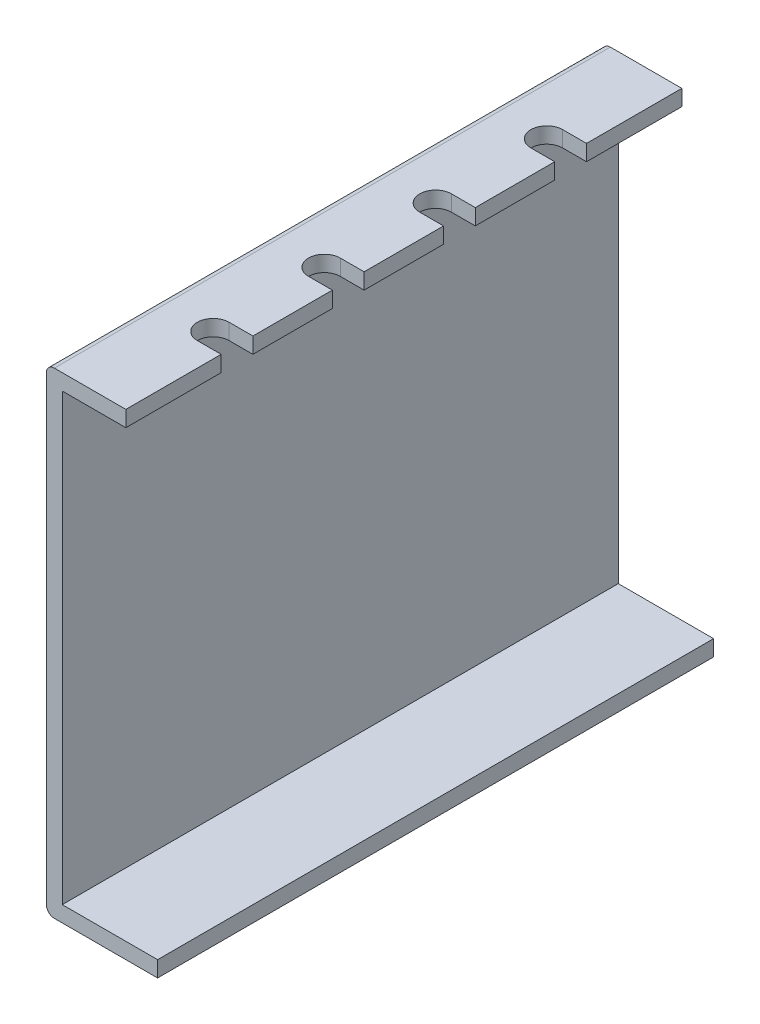
ISO-10303-21;
HEADER;
FILE_DESCRIPTION(('STEP AP214'),'2;1');
FILE_NAME('part.step','',(''),(''),'','','');
FILE_SCHEMA(('AUTOMOTIVE_DESIGN { 1 0 10303 214 1 1 1 1 }'));
ENDSEC;
DATA;
#1=APPLICATION_CONTEXT('core data for automotive mechanical design processes');
#2=APPLICATION_PROTOCOL_DEFINITION('international standard','automotive_design',2000,#1);
#3=PRODUCT_CONTEXT('',#1,'mechanical');
#4=PRODUCT('Part','Part','',(#3));
#5=PRODUCT_RELATED_PRODUCT_CATEGORY('part','',(#4));
#6=PRODUCT_DEFINITION_FORMATION('','',#4);
#7=PRODUCT_DEFINITION_CONTEXT('part definition',#1,'design');
#8=PRODUCT_DEFINITION('design','',#6,#7);
#9=PRODUCT_DEFINITION_SHAPE('','',#8);
#10=(LENGTH_UNIT() NAMED_UNIT(*) SI_UNIT(.MILLI.,.METRE.));
#11=(NAMED_UNIT(*) PLANE_ANGLE_UNIT() SI_UNIT($,.RADIAN.));
#12=(NAMED_UNIT(*) SI_UNIT($,.STERADIAN.) SOLID_ANGLE_UNIT());
#13=UNCERTAINTY_MEASURE_WITH_UNIT(LENGTH_MEASURE(1.E-05),#10,'distance_accuracy_value','');
#14=(GEOMETRIC_REPRESENTATION_CONTEXT(3) GLOBAL_UNCERTAINTY_ASSIGNED_CONTEXT((#13)) GLOBAL_UNIT_ASSIGNED_CONTEXT((#10,
#11,#12)) REPRESENTATION_CONTEXT('',''));
#15=CARTESIAN_POINT('',(0.,0.,0.));
#16=DIRECTION('',(0.,0.,1.));
#17=DIRECTION('',(1.,0.,0.));
#18=AXIS2_PLACEMENT_3D('',#15,#16,#17);
#19=CARTESIAN_POINT('',(50.,290.,175.));
#20=DIRECTION('',(-1.,0.,0.));
#21=DIRECTION('',(0.,0.,1.));
#22=AXIS2_PLACEMENT_3D('',#19,#20,#21);
#23=PLANE('',#22);
#24=DIRECTION('',(0.,0.,-1.));
#25=VECTOR('',#24,1.);
#26=CARTESIAN_POINT('',(50.,290.,175.));
#27=LINE('',#26,#25);
#28=CARTESIAN_POINT('',(50.,290.,25.));
#29=VERTEX_POINT('',#28);
#30=CARTESIAN_POINT('',(50.,290.,-25.));
#31=VERTEX_POINT('',#30);
#32=EDGE_CURVE('E471',#29,#31,#27,.T.);
#33=ORIENTED_EDGE('',*,*,#32,.T.);
#34=DIRECTION('',(0.,1.,0.));
#35=VECTOR('',#34,1.);
#36=CARTESIAN_POINT('',(50.,-0.000999999999973245,-25.));
#37=LINE('',#36,#35);
#38=CARTESIAN_POINT('',(50.,300.,-25.));
#39=VERTEX_POINT('',#38);
#40=EDGE_CURVE('E241',#31,#39,#37,.T.);
#41=ORIENTED_EDGE('',*,*,#40,.T.);
#42=DIRECTION('',(0.,0.,-1.));
#43=VECTOR('',#42,1.);
#44=CARTESIAN_POINT('',(50.,300.,175.));
#45=LINE('',#44,#43);
#46=CARTESIAN_POINT('',(50.,300.,25.));
#47=VERTEX_POINT('',#46);
#48=EDGE_CURVE('E459',#47,#39,#45,.T.);
#49=ORIENTED_EDGE('',*,*,#48,.F.);
#50=DIRECTION('',(0.,1.,0.));
#51=VECTOR('',#50,1.);
#52=CARTESIAN_POINT('',(50.,-0.000999999999973245,25.));
#53=LINE('',#52,#51);
#54=EDGE_CURVE('E265',#29,#47,#53,.T.);
#55=ORIENTED_EDGE('',*,*,#54,.F.);
#56=EDGE_LOOP('',(#33,#41,#49,#55));
#57=FACE_BOUND('',#56,.T.);
#58=ADVANCED_FACE('F33',(#57),#23,.F.);
#59=CARTESIAN_POINT('',(50.,290.,95.));
#60=VERTEX_POINT('',#59);
#61=CARTESIAN_POINT('',(50.,290.,45.));
#62=VERTEX_POINT('',#61);
#63=EDGE_CURVE('E363',#60,#62,#27,.T.);
#64=ORIENTED_EDGE('',*,*,#63,.T.);
#65=DIRECTION('',(0.,1.,0.));
#66=VECTOR('',#65,1.);
#67=CARTESIAN_POINT('',(50.,-0.000999999999973245,45.));
#68=LINE('',#67,#66);
#69=CARTESIAN_POINT('',(50.,300.,45.));
#70=VERTEX_POINT('',#69);
#71=EDGE_CURVE('E253',#62,#70,#68,.T.);
#72=ORIENTED_EDGE('',*,*,#71,.T.);
#73=CARTESIAN_POINT('',(50.,300.,95.));
#74=VERTEX_POINT('',#73);
#75=EDGE_CURVE('E357',#74,#70,#45,.T.);
#76=ORIENTED_EDGE('',*,*,#75,.F.);
#77=DIRECTION('',(0.,1.,0.));
#78=VECTOR('',#77,1.);
#79=CARTESIAN_POINT('',(50.,-0.000999999999973245,95.));
#80=LINE('',#79,#78);
#81=EDGE_CURVE('E288',#60,#74,#80,.T.);
#82=ORIENTED_EDGE('',*,*,#81,.F.);
#83=EDGE_LOOP('',(#64,#72,#76,#82));
#84=FACE_BOUND('',#83,.T.);
#85=ADVANCED_FACE('F457',(#84),#23,.F.);
#86=CARTESIAN_POINT('',(50.,290.,175.));
#87=VERTEX_POINT('',#86);
#88=CARTESIAN_POINT('',(50.,290.,115.));
#89=VERTEX_POINT('',#88);
#90=EDGE_CURVE('E359',#87,#89,#27,.T.);
#91=ORIENTED_EDGE('',*,*,#90,.T.);
#92=DIRECTION('',(0.,1.,0.));
#93=VECTOR('',#92,1.);
#94=CARTESIAN_POINT('',(50.,-0.000999999999973245,115.));
#95=LINE('',#94,#93);
#96=CARTESIAN_POINT('',(50.,300.,115.));
#97=VERTEX_POINT('',#96);
#98=EDGE_CURVE('E277',#89,#97,#95,.T.);
#99=ORIENTED_EDGE('',*,*,#98,.T.);
#100=CARTESIAN_POINT('',(50.,300.,175.));
#101=VERTEX_POINT('',#100);
#102=EDGE_CURVE('E353',#101,#97,#45,.T.);
#103=ORIENTED_EDGE('',*,*,#102,.F.);
#104=DIRECTION('',(0.,1.,0.));
#105=VECTOR('',#104,1.);
#106=CARTESIAN_POINT('',(50.,290.,175.));
#107=LINE('',#106,#105);
#108=EDGE_CURVE('E334',#87,#101,#107,.T.);
#109=ORIENTED_EDGE('',*,*,#108,.F.);
#110=EDGE_LOOP('',(#91,#99,#103,#109));
#111=FACE_BOUND('',#110,.T.);
#112=ADVANCED_FACE('F439',(#111),#23,.F.);
#113=CARTESIAN_POINT('',(50.,300.,-45.));
#114=VERTEX_POINT('',#113);
#115=CARTESIAN_POINT('',(50.,300.,-95.));
#116=VERTEX_POINT('',#115);
#117=EDGE_CURVE('E358',#114,#116,#45,.T.);
#118=ORIENTED_EDGE('',*,*,#117,.F.);
#119=DIRECTION('',(0.,1.,0.));
#120=VECTOR('',#119,1.);
#121=CARTESIAN_POINT('',(50.,-0.000999999999973245,-45.));
#122=LINE('',#121,#120);
#123=CARTESIAN_POINT('',(50.,290.,-45.));
#124=VERTEX_POINT('',#123);
#125=EDGE_CURVE('E219',#124,#114,#122,.T.);
#126=ORIENTED_EDGE('',*,*,#125,.F.);
#127=CARTESIAN_POINT('',(50.,290.,-95.));
#128=VERTEX_POINT('',#127);
#129=EDGE_CURVE('E232',#124,#128,#27,.T.);
#130=ORIENTED_EDGE('',*,*,#129,.T.);
#131=DIRECTION('',(0.,1.,0.));
#132=VECTOR('',#131,1.);
#133=CARTESIAN_POINT('',(50.,-0.000999999999973245,-95.));
#134=LINE('',#133,#132);
#135=EDGE_CURVE('E301',#128,#116,#134,.T.);
#136=ORIENTED_EDGE('',*,*,#135,.T.);
#137=EDGE_LOOP('',(#118,#126,#130,#136));
#138=FACE_BOUND('',#137,.T.);
#139=ADVANCED_FACE('F470',(#138),#23,.F.);
#140=CARTESIAN_POINT('',(50.,300.,175.));
#141=DIRECTION('',(0.,-1.,0.));
#142=DIRECTION('',(0.,0.,-1.));
#143=AXIS2_PLACEMENT_3D('',#140,#141,#142);
#144=PLANE('',#143);
#145=DIRECTION('',(-1.,0.,0.));
#146=VECTOR('',#145,1.);
#147=CARTESIAN_POINT('',(50.,300.,-175.));
#148=LINE('',#147,#146);
#149=CARTESIAN_POINT('',(50.,300.,-175.));
#150=VERTEX_POINT('',#149);
#151=CARTESIAN_POINT('',(4.99999999999998,300.,-175.));
#152=VERTEX_POINT('',#151);
#153=EDGE_CURVE('E318',#150,#152,#148,.T.);
#154=ORIENTED_EDGE('',*,*,#153,.T.);
#155=DIRECTION('',(0.,0.,-1.));
#156=VECTOR('',#155,1.);
#157=CARTESIAN_POINT('',(4.99999999999998,300.,175.));
#158=LINE('',#157,#156);
#159=CARTESIAN_POINT('',(4.99999999999998,300.,175.));
#160=VERTEX_POINT('',#159);
#161=EDGE_CURVE('E11',#152,#160,#158,.F.);
#162=ORIENTED_EDGE('',*,*,#161,.T.);
#163=DIRECTION('',(-1.,0.,0.));
#164=VECTOR('',#163,1.);
#165=CARTESIAN_POINT('',(50.,300.,175.));
#166=LINE('',#165,#164);
#167=EDGE_CURVE('E319',#101,#160,#166,.T.);
#168=ORIENTED_EDGE('',*,*,#167,.F.);
#169=ORIENTED_EDGE('',*,*,#102,.T.);
#170=DIRECTION('',(1.,0.,0.));
#171=VECTOR('',#170,1.);
#172=CARTESIAN_POINT('',(35.,300.,115.));
#173=LINE('',#172,#171);
#174=CARTESIAN_POINT('',(35.,300.,115.));
#175=VERTEX_POINT('',#174);
#176=EDGE_CURVE('E278',#175,#97,#173,.T.);
#177=ORIENTED_EDGE('',*,*,#176,.F.);
#178=CARTESIAN_POINT('',(35.,300.,105.));
#179=DIRECTION('',(0.,1.,0.));
#180=DIRECTION('',(0.,0.,1.));
#181=AXIS2_PLACEMENT_3D('',#178,#179,#180);
#182=CIRCLE('',#181,10.);
#183=CARTESIAN_POINT('',(35.,300.,95.));
#184=VERTEX_POINT('',#183);
#185=EDGE_CURVE('E272',#184,#175,#182,.T.);
#186=ORIENTED_EDGE('',*,*,#185,.F.);
#187=DIRECTION('',(-1.,0.,0.));
#188=VECTOR('',#187,1.);
#189=CARTESIAN_POINT('',(35.,300.,95.));
#190=LINE('',#189,#188);
#191=EDGE_CURVE('E274',#74,#184,#190,.T.);
#192=ORIENTED_EDGE('',*,*,#191,.F.);
#193=ORIENTED_EDGE('',*,*,#75,.T.);
#194=DIRECTION('',(1.,0.,0.));
#195=VECTOR('',#194,1.);
#196=CARTESIAN_POINT('',(35.,300.,45.));
#197=LINE('',#196,#195);
#198=CARTESIAN_POINT('',(35.,300.,45.));
#199=VERTEX_POINT('',#198);
#200=EDGE_CURVE('E254',#199,#70,#197,.T.);
#201=ORIENTED_EDGE('',*,*,#200,.F.);
#202=CARTESIAN_POINT('',(35.,300.,35.));
#203=DIRECTION('',(0.,1.,0.));
#204=DIRECTION('',(0.,0.,1.));
#205=AXIS2_PLACEMENT_3D('',#202,#203,#204);
#206=CIRCLE('',#205,10.);
#207=CARTESIAN_POINT('',(35.,300.,25.));
#208=VERTEX_POINT('',#207);
#209=EDGE_CURVE('E248',#208,#199,#206,.T.);
#210=ORIENTED_EDGE('',*,*,#209,.F.);
#211=DIRECTION('',(-1.,0.,0.));
#212=VECTOR('',#211,1.);
#213=CARTESIAN_POINT('',(35.,300.,25.));
#214=LINE('',#213,#212);
#215=EDGE_CURVE('E250',#47,#208,#214,.T.);
#216=ORIENTED_EDGE('',*,*,#215,.F.);
#217=ORIENTED_EDGE('',*,*,#48,.T.);
#218=DIRECTION('',(1.,0.,0.));
#219=VECTOR('',#218,1.);
#220=CARTESIAN_POINT('',(35.,300.,-25.));
#221=LINE('',#220,#219);
#222=CARTESIAN_POINT('',(35.,300.,-25.));
#223=VERTEX_POINT('',#222);
#224=EDGE_CURVE('E488',#223,#39,#221,.T.);
#225=ORIENTED_EDGE('',*,*,#224,.F.);
#226=CARTESIAN_POINT('',(35.,300.,-35.));
#227=DIRECTION('',(0.,1.,0.));
#228=DIRECTION('',(0.,0.,1.));
#229=AXIS2_PLACEMENT_3D('',#226,#227,#228);
#230=CIRCLE('',#229,10.);
#231=CARTESIAN_POINT('',(35.,300.,-45.));
#232=VERTEX_POINT('',#231);
#233=EDGE_CURVE('E235',#232,#223,#230,.T.);
#234=ORIENTED_EDGE('',*,*,#233,.F.);
#235=DIRECTION('',(-1.,0.,0.));
#236=VECTOR('',#235,1.);
#237=CARTESIAN_POINT('',(35.,300.,-45.));
#238=LINE('',#237,#236);
#239=EDGE_CURVE('E214',#114,#232,#238,.T.);
#240=ORIENTED_EDGE('',*,*,#239,.F.);
#241=ORIENTED_EDGE('',*,*,#117,.T.);
#242=DIRECTION('',(1.,0.,0.));
#243=VECTOR('',#242,1.);
#244=CARTESIAN_POINT('',(35.,300.,-95.));
#245=LINE('',#244,#243);
#246=CARTESIAN_POINT('',(35.,300.,-95.));
#247=VERTEX_POINT('',#246);
#248=EDGE_CURVE('E302',#247,#116,#245,.T.);
#249=ORIENTED_EDGE('',*,*,#248,.F.);
#250=CARTESIAN_POINT('',(35.,300.,-105.));
#251=DIRECTION('',(0.,1.,0.));
#252=DIRECTION('',(0.,0.,1.));
#253=AXIS2_PLACEMENT_3D('',#250,#251,#252);
#254=CIRCLE('',#253,10.);
#255=CARTESIAN_POINT('',(35.,300.,-115.));
#256=VERTEX_POINT('',#255);
#257=EDGE_CURVE('E296',#256,#247,#254,.T.);
#258=ORIENTED_EDGE('',*,*,#257,.F.);
#259=DIRECTION('',(-1.,0.,0.));
#260=VECTOR('',#259,1.);
#261=CARTESIAN_POINT('',(35.,300.,-115.));
#262=LINE('',#261,#260);
#263=CARTESIAN_POINT('',(50.,300.,-115.));
#264=VERTEX_POINT('',#263);
#265=EDGE_CURVE('E298',#264,#256,#262,.T.);
#266=ORIENTED_EDGE('',*,*,#265,.F.);
#267=EDGE_CURVE('E336',#264,#150,#45,.T.);
#268=ORIENTED_EDGE('',*,*,#267,.T.);
#269=EDGE_LOOP('',(#154,#162,#168,#169,#177,#186,#192,#193,#201,#210,#216,#217,#225,#234,#240,
#241,#249,#258,#266,#268));
#270=FACE_BOUND('',#269,.T.);
#271=ADVANCED_FACE('F409',(#270),#144,.F.);
#272=CARTESIAN_POINT('',(0.,300.,175.));
#273=DIRECTION('',(1.,0.,0.));
#274=DIRECTION('',(0.,1.,0.));
#275=AXIS2_PLACEMENT_3D('',#272,#273,#274);
#276=PLANE('',#275);
#277=DIRECTION('',(0.,-1.,0.));
#278=VECTOR('',#277,1.);
#279=CARTESIAN_POINT('',(0.,300.,-175.));
#280=LINE('',#279,#278);
#281=CARTESIAN_POINT('',(0.,295.,-175.));
#282=VERTEX_POINT('',#281);
#283=CARTESIAN_POINT('',(0.,5.,-175.));
#284=VERTEX_POINT('',#283);
#285=EDGE_CURVE('E338',#282,#284,#280,.T.);
#286=ORIENTED_EDGE('',*,*,#285,.T.);
#287=DIRECTION('',(0.,0.,-1.));
#288=VECTOR('',#287,1.);
#289=CARTESIAN_POINT('',(0.,5.,175.));
#290=LINE('',#289,#288);
#291=CARTESIAN_POINT('',(0.,5.,175.));
#292=VERTEX_POINT('',#291);
#293=EDGE_CURVE('E54',#284,#292,#290,.F.);
#294=ORIENTED_EDGE('',*,*,#293,.T.);
#295=DIRECTION('',(0.,-1.,0.));
#296=VECTOR('',#295,1.);
#297=CARTESIAN_POINT('',(0.,300.,175.));
#298=LINE('',#297,#296);
#299=CARTESIAN_POINT('',(0.,295.,175.));
#300=VERTEX_POINT('',#299);
#301=EDGE_CURVE('E321',#300,#292,#298,.T.);
#302=ORIENTED_EDGE('',*,*,#301,.F.);
#303=DIRECTION('',(0.,0.,-1.));
#304=VECTOR('',#303,1.);
#305=CARTESIAN_POINT('',(0.,295.,175.));
#306=LINE('',#305,#304);
#307=EDGE_CURVE('E382',#300,#282,#306,.T.);
#308=ORIENTED_EDGE('',*,*,#307,.T.);
#309=EDGE_LOOP('',(#286,#294,#302,#308));
#310=FACE_BOUND('',#309,.T.);
#311=ADVANCED_FACE('F403',(#310),#276,.F.);
#312=CARTESIAN_POINT('',(0.,0.,175.));
#313=DIRECTION('',(0.,1.,0.));
#314=DIRECTION('',(-1.,0.,0.));
#315=AXIS2_PLACEMENT_3D('',#312,#313,#314);
#316=PLANE('',#315);
#317=DIRECTION('',(1.,0.,0.));
#318=VECTOR('',#317,1.);
#319=CARTESIAN_POINT('',(0.,0.,175.));
#320=LINE('',#319,#318);
#321=CARTESIAN_POINT('',(5.,0.,175.));
#322=VERTEX_POINT('',#321);
#323=CARTESIAN_POINT('',(70.,0.,175.));
#324=VERTEX_POINT('',#323);
#325=EDGE_CURVE('E324',#322,#324,#320,.T.);
#326=ORIENTED_EDGE('',*,*,#325,.F.);
#327=DIRECTION('',(0.,0.,-1.));
#328=VECTOR('',#327,1.);
#329=CARTESIAN_POINT('',(5.,0.,175.));
#330=LINE('',#329,#328);
#331=CARTESIAN_POINT('',(5.,0.,-175.));
#332=VERTEX_POINT('',#331);
#333=EDGE_CURVE('E375',#322,#332,#330,.T.);
#334=ORIENTED_EDGE('',*,*,#333,.T.);
#335=DIRECTION('',(1.,0.,0.));
#336=VECTOR('',#335,1.);
#337=CARTESIAN_POINT('',(0.,0.,-175.));
#338=LINE('',#337,#336);
#339=CARTESIAN_POINT('',(70.,0.,-175.));
#340=VERTEX_POINT('',#339);
#341=EDGE_CURVE('E340',#332,#340,#338,.T.);
#342=ORIENTED_EDGE('',*,*,#341,.T.);
#343=DIRECTION('',(0.,0.,-1.));
#344=VECTOR('',#343,1.);
#345=CARTESIAN_POINT('',(70.,0.,175.));
#346=LINE('',#345,#344);
#347=EDGE_CURVE('E372',#324,#340,#346,.T.);
#348=ORIENTED_EDGE('',*,*,#347,.F.);
#349=EDGE_LOOP('',(#326,#334,#342,#348));
#350=FACE_BOUND('',#349,.T.);
#351=ADVANCED_FACE('F395',(#350),#316,.F.);
#352=CARTESIAN_POINT('',(70.,10.,175.));
#353=DIRECTION('',(-1.,0.,0.));
#354=DIRECTION('',(0.,0.,1.));
#355=AXIS2_PLACEMENT_3D('',#352,#353,#354);
#356=PLANE('',#355);
#357=DIRECTION('',(0.,1.,0.));
#358=VECTOR('',#357,1.);
#359=CARTESIAN_POINT('',(70.,10.,-175.));
#360=LINE('',#359,#358);
#361=CARTESIAN_POINT('',(70.,10.,-175.));
#362=VERTEX_POINT('',#361);
#363=EDGE_CURVE('E342',#340,#362,#360,.T.);
#364=ORIENTED_EDGE('',*,*,#363,.T.);
#365=DIRECTION('',(0.,0.,-1.));
#366=VECTOR('',#365,1.);
#367=CARTESIAN_POINT('',(70.,10.,175.));
#368=LINE('',#367,#366);
#369=CARTESIAN_POINT('',(70.,10.,175.));
#370=VERTEX_POINT('',#369);
#371=EDGE_CURVE('E369',#370,#362,#368,.T.);
#372=ORIENTED_EDGE('',*,*,#371,.F.);
#373=DIRECTION('',(0.,1.,0.));
#374=VECTOR('',#373,1.);
#375=CARTESIAN_POINT('',(70.,10.,175.));
#376=LINE('',#375,#374);
#377=EDGE_CURVE('E326',#324,#370,#376,.T.);
#378=ORIENTED_EDGE('',*,*,#377,.F.);
#379=ORIENTED_EDGE('',*,*,#347,.T.);
#380=EDGE_LOOP('',(#364,#372,#378,#379));
#381=FACE_BOUND('',#380,.T.);
#382=ADVANCED_FACE('F433',(#381),#356,.F.);
#383=CARTESIAN_POINT('',(70.,10.,175.));
#384=DIRECTION('',(0.,-1.,0.));
#385=DIRECTION('',(1.,0.,0.));
#386=AXIS2_PLACEMENT_3D('',#383,#384,#385);
#387=PLANE('',#386);
#388=DIRECTION('',(-1.,0.,0.));
#389=VECTOR('',#388,1.);
#390=CARTESIAN_POINT('',(70.,10.,-175.));
#391=LINE('',#390,#389);
#392=CARTESIAN_POINT('',(10.,9.99999999999998,-175.));
#393=VERTEX_POINT('',#392);
#394=EDGE_CURVE('E344',#362,#393,#391,.T.);
#395=ORIENTED_EDGE('',*,*,#394,.T.);
#396=DIRECTION('',(0.,0.,-1.));
#397=VECTOR('',#396,1.);
#398=CARTESIAN_POINT('',(10.,9.99999999999998,175.));
#399=LINE('',#398,#397);
#400=CARTESIAN_POINT('',(10.,9.99999999999998,175.));
#401=VERTEX_POINT('',#400);
#402=EDGE_CURVE('E366',#401,#393,#399,.T.);
#403=ORIENTED_EDGE('',*,*,#402,.F.);
#404=DIRECTION('',(-1.,0.,0.));
#405=VECTOR('',#404,1.);
#406=CARTESIAN_POINT('',(70.,10.,175.));
#407=LINE('',#406,#405);
#408=EDGE_CURVE('E328',#370,#401,#407,.T.);
#409=ORIENTED_EDGE('',*,*,#408,.F.);
#410=ORIENTED_EDGE('',*,*,#371,.T.);
#411=EDGE_LOOP('',(#395,#403,#409,#410));
#412=FACE_BOUND('',#411,.T.);
#413=ADVANCED_FACE('F430',(#412),#387,.F.);
#414=CARTESIAN_POINT('',(10.,9.99999999999998,175.));
#415=DIRECTION('',(-1.,0.,0.));
#416=DIRECTION('',(0.,-1.,0.));
#417=AXIS2_PLACEMENT_3D('',#414,#415,#416);
#418=PLANE('',#417);
#419=DIRECTION('',(0.,1.,0.));
#420=VECTOR('',#419,1.);
#421=CARTESIAN_POINT('',(10.,9.99999999999998,-175.));
#422=LINE('',#421,#420);
#423=CARTESIAN_POINT('',(9.99999999999994,290.,-175.));
#424=VERTEX_POINT('',#423);
#425=EDGE_CURVE('E346',#393,#424,#422,.T.);
#426=ORIENTED_EDGE('',*,*,#425,.T.);
#427=DIRECTION('',(0.,0.,-1.));
#428=VECTOR('',#427,1.);
#429=CARTESIAN_POINT('',(9.99999999999994,290.,175.));
#430=LINE('',#429,#428);
#431=CARTESIAN_POINT('',(9.99999999999994,290.,175.));
#432=VERTEX_POINT('',#431);
#433=EDGE_CURVE('E362',#432,#424,#430,.T.);
#434=ORIENTED_EDGE('',*,*,#433,.F.);
#435=DIRECTION('',(0.,1.,0.));
#436=VECTOR('',#435,1.);
#437=CARTESIAN_POINT('',(10.,9.99999999999998,175.));
#438=LINE('',#437,#436);
#439=EDGE_CURVE('E330',#401,#432,#438,.T.);
#440=ORIENTED_EDGE('',*,*,#439,.F.);
#441=ORIENTED_EDGE('',*,*,#402,.T.);
#442=EDGE_LOOP('',(#426,#434,#440,#441));
#443=FACE_BOUND('',#442,.T.);
#444=ADVANCED_FACE('F426',(#443),#418,.F.);
#445=CARTESIAN_POINT('',(9.99999999999994,290.,175.));
#446=DIRECTION('',(0.,1.,0.));
#447=DIRECTION('',(0.,0.,1.));
#448=AXIS2_PLACEMENT_3D('',#445,#446,#447);
#449=PLANE('',#448);
#450=CARTESIAN_POINT('',(35.,290.,-35.));
#451=DIRECTION('',(0.,1.,0.));
#452=DIRECTION('',(0.,0.,1.));
#453=AXIS2_PLACEMENT_3D('',#450,#451,#452);
#454=CIRCLE('',#453,10.);
#455=CARTESIAN_POINT('',(35.,290.,-25.));
#456=VERTEX_POINT('',#455);
#457=CARTESIAN_POINT('',(35.,290.,-45.));
#458=VERTEX_POINT('',#457);
#459=EDGE_CURVE('E223',#456,#458,#454,.F.);
#460=ORIENTED_EDGE('',*,*,#459,.F.);
#461=DIRECTION('',(-1.,0.,0.));
#462=VECTOR('',#461,1.);
#463=CARTESIAN_POINT('',(35.,290.,-25.));
#464=LINE('',#463,#462);
#465=EDGE_CURVE('E233',#31,#456,#464,.T.);
#466=ORIENTED_EDGE('',*,*,#465,.F.);
#467=ORIENTED_EDGE('',*,*,#32,.F.);
#468=DIRECTION('',(1.,0.,0.));
#469=VECTOR('',#468,1.);
#470=CARTESIAN_POINT('',(35.,290.,25.));
#471=LINE('',#470,#469);
#472=CARTESIAN_POINT('',(35.,290.,25.));
#473=VERTEX_POINT('',#472);
#474=EDGE_CURVE('E249',#473,#29,#471,.T.);
#475=ORIENTED_EDGE('',*,*,#474,.F.);
#476=CARTESIAN_POINT('',(35.,290.,35.));
#477=DIRECTION('',(0.,1.,0.));
#478=DIRECTION('',(0.,0.,1.));
#479=AXIS2_PLACEMENT_3D('',#476,#477,#478);
#480=CIRCLE('',#479,10.);
#481=CARTESIAN_POINT('',(35.,290.,45.));
#482=VERTEX_POINT('',#481);
#483=EDGE_CURVE('E259',#482,#473,#480,.F.);
#484=ORIENTED_EDGE('',*,*,#483,.F.);
#485=DIRECTION('',(-1.,0.,0.));
#486=VECTOR('',#485,1.);
#487=CARTESIAN_POINT('',(35.,290.,45.));
#488=LINE('',#487,#486);
#489=EDGE_CURVE('E246',#62,#482,#488,.T.);
#490=ORIENTED_EDGE('',*,*,#489,.F.);
#491=ORIENTED_EDGE('',*,*,#63,.F.);
#492=DIRECTION('',(1.,0.,0.));
#493=VECTOR('',#492,1.);
#494=CARTESIAN_POINT('',(35.,290.,95.));
#495=LINE('',#494,#493);
#496=CARTESIAN_POINT('',(35.,290.,95.));
#497=VERTEX_POINT('',#496);
#498=EDGE_CURVE('E273',#497,#60,#495,.T.);
#499=ORIENTED_EDGE('',*,*,#498,.F.);
#500=CARTESIAN_POINT('',(35.,290.,105.));
#501=DIRECTION('',(0.,1.,0.));
#502=DIRECTION('',(0.,0.,1.));
#503=AXIS2_PLACEMENT_3D('',#500,#501,#502);
#504=CIRCLE('',#503,10.);
#505=CARTESIAN_POINT('',(35.,290.,115.));
#506=VERTEX_POINT('',#505);
#507=EDGE_CURVE('E283',#506,#497,#504,.F.);
#508=ORIENTED_EDGE('',*,*,#507,.F.);
#509=DIRECTION('',(-1.,0.,0.));
#510=VECTOR('',#509,1.);
#511=CARTESIAN_POINT('',(35.,290.,115.));
#512=LINE('',#511,#510);
#513=EDGE_CURVE('E270',#89,#506,#512,.T.);
#514=ORIENTED_EDGE('',*,*,#513,.F.);
#515=ORIENTED_EDGE('',*,*,#90,.F.);
#516=DIRECTION('',(1.,0.,0.));
#517=VECTOR('',#516,1.);
#518=CARTESIAN_POINT('',(9.99999999999994,290.,175.));
#519=LINE('',#518,#517);
#520=EDGE_CURVE('E332',#432,#87,#519,.T.);
#521=ORIENTED_EDGE('',*,*,#520,.F.);
#522=ORIENTED_EDGE('',*,*,#433,.T.);
#523=DIRECTION('',(1.,0.,0.));
#524=VECTOR('',#523,1.);
#525=CARTESIAN_POINT('',(9.99999999999994,290.,-175.));
#526=LINE('',#525,#524);
#527=CARTESIAN_POINT('',(50.,290.,-175.));
#528=VERTEX_POINT('',#527);
#529=EDGE_CURVE('E348',#424,#528,#526,.T.);
#530=ORIENTED_EDGE('',*,*,#529,.T.);
#531=CARTESIAN_POINT('',(50.,290.,-115.));
#532=VERTEX_POINT('',#531);
#533=EDGE_CURVE('E356',#532,#528,#27,.T.);
#534=ORIENTED_EDGE('',*,*,#533,.F.);
#535=DIRECTION('',(1.,0.,0.));
#536=VECTOR('',#535,1.);
#537=CARTESIAN_POINT('',(35.,290.,-115.));
#538=LINE('',#537,#536);
#539=CARTESIAN_POINT('',(35.,290.,-115.));
#540=VERTEX_POINT('',#539);
#541=EDGE_CURVE('E297',#540,#532,#538,.T.);
#542=ORIENTED_EDGE('',*,*,#541,.F.);
#543=CARTESIAN_POINT('',(35.,290.,-105.));
#544=DIRECTION('',(0.,1.,0.));
#545=DIRECTION('',(0.,0.,1.));
#546=AXIS2_PLACEMENT_3D('',#543,#544,#545);
#547=CIRCLE('',#546,10.);
#548=CARTESIAN_POINT('',(35.,290.,-95.));
#549=VERTEX_POINT('',#548);
#550=EDGE_CURVE('E245',#549,#540,#547,.F.);
#551=ORIENTED_EDGE('',*,*,#550,.F.);
#552=DIRECTION('',(-1.,0.,0.));
#553=VECTOR('',#552,1.);
#554=CARTESIAN_POINT('',(35.,290.,-95.));
#555=LINE('',#554,#553);
#556=EDGE_CURVE('E293',#128,#549,#555,.T.);
#557=ORIENTED_EDGE('',*,*,#556,.F.);
#558=ORIENTED_EDGE('',*,*,#129,.F.);
#559=DIRECTION('',(1.,0.,0.));
#560=VECTOR('',#559,1.);
#561=CARTESIAN_POINT('',(35.,290.,-45.));
#562=LINE('',#561,#560);
#563=EDGE_CURVE('E211',#458,#124,#562,.T.);
#564=ORIENTED_EDGE('',*,*,#563,.F.);
#565=EDGE_LOOP('',(#460,#466,#467,#475,#484,#490,#491,#499,#508,#514,#515,#521,#522,#530,#534,
#542,#551,#557,#558,#564));
#566=FACE_BOUND('',#565,.T.);
#567=ADVANCED_FACE('F230',(#566),#449,.F.);
#568=ORIENTED_EDGE('',*,*,#267,.F.);
#569=DIRECTION('',(0.,1.,0.));
#570=VECTOR('',#569,1.);
#571=CARTESIAN_POINT('',(50.,-0.000999999999973245,-115.));
#572=LINE('',#571,#570);
#573=EDGE_CURVE('E313',#532,#264,#572,.T.);
#574=ORIENTED_EDGE('',*,*,#573,.F.);
#575=ORIENTED_EDGE('',*,*,#533,.T.);
#576=DIRECTION('',(0.,1.,0.));
#577=VECTOR('',#576,1.);
#578=CARTESIAN_POINT('',(50.,290.,-175.));
#579=LINE('',#578,#577);
#580=EDGE_CURVE('E322',#528,#150,#579,.T.);
#581=ORIENTED_EDGE('',*,*,#580,.T.);
#582=EDGE_LOOP('',(#568,#574,#575,#581));
#583=FACE_BOUND('',#582,.T.);
#584=ADVANCED_FACE('F415',(#583),#23,.F.);
#585=CARTESIAN_POINT('',(0.,0.,175.));
#586=DIRECTION('',(0.,0.,1.));
#587=DIRECTION('',(1.,0.,0.));
#588=AXIS2_PLACEMENT_3D('',#585,#586,#587);
#589=PLANE('',#588);
#590=ORIENTED_EDGE('',*,*,#301,.T.);
#591=CARTESIAN_POINT('',(5.,5.,175.));
#592=DIRECTION('',(0.,0.,1.));
#593=DIRECTION('',(1.,0.,0.));
#594=AXIS2_PLACEMENT_3D('',#591,#592,#593);
#595=CIRCLE('',#594,5.);
#596=EDGE_CURVE('E41',#292,#322,#595,.T.);
#597=ORIENTED_EDGE('',*,*,#596,.T.);
#598=ORIENTED_EDGE('',*,*,#325,.T.);
#599=ORIENTED_EDGE('',*,*,#377,.T.);
#600=ORIENTED_EDGE('',*,*,#408,.T.);
#601=ORIENTED_EDGE('',*,*,#439,.T.);
#602=ORIENTED_EDGE('',*,*,#520,.T.);
#603=ORIENTED_EDGE('',*,*,#108,.T.);
#604=ORIENTED_EDGE('',*,*,#167,.T.);
#605=CARTESIAN_POINT('',(4.99999999999999,295.,175.));
#606=DIRECTION('',(0.,0.,1.));
#607=DIRECTION('',(1.,0.,0.));
#608=AXIS2_PLACEMENT_3D('',#605,#606,#607);
#609=CIRCLE('',#608,5.);
#610=EDGE_CURVE('E386',#160,#300,#609,.T.);
#611=ORIENTED_EDGE('',*,*,#610,.T.);
#612=EDGE_LOOP('',(#590,#597,#598,#599,#600,#601,#602,#603,#604,#611));
#613=FACE_BOUND('',#612,.T.);
#614=ADVANCED_FACE('F390',(#613),#589,.T.);
#615=CARTESIAN_POINT('',(0.,0.,-175.));
#616=DIRECTION('',(0.,0.,1.));
#617=DIRECTION('',(1.,0.,0.));
#618=AXIS2_PLACEMENT_3D('',#615,#616,#617);
#619=PLANE('',#618);
#620=ORIENTED_EDGE('',*,*,#341,.F.);
#621=CARTESIAN_POINT('',(5.,5.,-175.));
#622=DIRECTION('',(0.,0.,1.));
#623=DIRECTION('',(1.,0.,0.));
#624=AXIS2_PLACEMENT_3D('',#621,#622,#623);
#625=CIRCLE('',#624,5.);
#626=EDGE_CURVE('E380',#332,#284,#625,.F.);
#627=ORIENTED_EDGE('',*,*,#626,.T.);
#628=ORIENTED_EDGE('',*,*,#285,.F.);
#629=CARTESIAN_POINT('',(4.99999999999999,295.,-175.));
#630=DIRECTION('',(0.,0.,1.));
#631=DIRECTION('',(1.,0.,0.));
#632=AXIS2_PLACEMENT_3D('',#629,#630,#631);
#633=CIRCLE('',#632,5.);
#634=EDGE_CURVE('E378',#282,#152,#633,.F.);
#635=ORIENTED_EDGE('',*,*,#634,.T.);
#636=ORIENTED_EDGE('',*,*,#153,.F.);
#637=ORIENTED_EDGE('',*,*,#580,.F.);
#638=ORIENTED_EDGE('',*,*,#529,.F.);
#639=ORIENTED_EDGE('',*,*,#425,.F.);
#640=ORIENTED_EDGE('',*,*,#394,.F.);
#641=ORIENTED_EDGE('',*,*,#363,.F.);
#642=EDGE_LOOP('',(#620,#627,#628,#635,#636,#637,#638,#639,#640,#641));
#643=FACE_BOUND('',#642,.T.);
#644=ADVANCED_FACE('F401',(#643),#619,.F.);
#645=CARTESIAN_POINT('',(35.,-0.000999999999973245,-95.));
#646=DIRECTION('',(0.,0.,1.));
#647=DIRECTION('',(1.,0.,0.));
#648=AXIS2_PLACEMENT_3D('',#645,#646,#647);
#649=PLANE('',#648);
#650=ORIENTED_EDGE('',*,*,#556,.T.);
#651=DIRECTION('',(0.,1.,0.));
#652=VECTOR('',#651,1.);
#653=CARTESIAN_POINT('',(35.,-0.000999999999973245,-95.));
#654=LINE('',#653,#652);
#655=EDGE_CURVE('E312',#549,#247,#654,.T.);
#656=ORIENTED_EDGE('',*,*,#655,.T.);
#657=ORIENTED_EDGE('',*,*,#248,.T.);
#658=ORIENTED_EDGE('',*,*,#135,.F.);
#659=EDGE_LOOP('',(#650,#656,#657,#658));
#660=FACE_BOUND('',#659,.T.);
#661=ADVANCED_FACE('F469',(#660),#649,.F.);
#662=CARTESIAN_POINT('',(35.,-0.000999999999973245,-115.));
#663=DIRECTION('',(0.,0.,-1.));
#664=DIRECTION('',(-1.,0.,0.));
#665=AXIS2_PLACEMENT_3D('',#662,#663,#664);
#666=PLANE('',#665);
#667=ORIENTED_EDGE('',*,*,#541,.T.);
#668=ORIENTED_EDGE('',*,*,#573,.T.);
#669=ORIENTED_EDGE('',*,*,#265,.T.);
#670=DIRECTION('',(0.,1.,0.));
#671=VECTOR('',#670,1.);
#672=CARTESIAN_POINT('',(35.,-0.000999999999973245,-115.));
#673=LINE('',#672,#671);
#674=EDGE_CURVE('E310',#540,#256,#673,.T.);
#675=ORIENTED_EDGE('',*,*,#674,.F.);
#676=EDGE_LOOP('',(#667,#668,#669,#675));
#677=FACE_BOUND('',#676,.T.);
#678=ADVANCED_FACE('F538',(#677),#666,.F.);
#679=CARTESIAN_POINT('',(35.,-0.000999999999973245,-105.));
#680=DIRECTION('',(0.,1.,0.));
#681=DIRECTION('',(0.,0.,1.));
#682=AXIS2_PLACEMENT_3D('',#679,#680,#681);
#683=CYLINDRICAL_SURFACE('',#682,10.);
#684=ORIENTED_EDGE('',*,*,#550,.T.);
#685=ORIENTED_EDGE('',*,*,#674,.T.);
#686=ORIENTED_EDGE('',*,*,#257,.T.);
#687=ORIENTED_EDGE('',*,*,#655,.F.);
#688=EDGE_LOOP('',(#684,#685,#686,#687));
#689=FACE_BOUND('',#688,.T.);
#690=ADVANCED_FACE('F533',(#689),#683,.F.);
#691=CARTESIAN_POINT('',(35.,-0.000999999999973245,115.));
#692=DIRECTION('',(0.,0.,1.));
#693=DIRECTION('',(1.,0.,0.));
#694=AXIS2_PLACEMENT_3D('',#691,#692,#693);
#695=PLANE('',#694);
#696=ORIENTED_EDGE('',*,*,#513,.T.);
#697=DIRECTION('',(0.,1.,0.));
#698=VECTOR('',#697,1.);
#699=CARTESIAN_POINT('',(35.,-0.000999999999973245,115.));
#700=LINE('',#699,#698);
#701=EDGE_CURVE('E262',#506,#175,#700,.T.);
#702=ORIENTED_EDGE('',*,*,#701,.T.);
#703=ORIENTED_EDGE('',*,*,#176,.T.);
#704=ORIENTED_EDGE('',*,*,#98,.F.);
#705=EDGE_LOOP('',(#696,#702,#703,#704));
#706=FACE_BOUND('',#705,.T.);
#707=ADVANCED_FACE('F444',(#706),#695,.F.);
#708=CARTESIAN_POINT('',(35.,-0.000999999999973245,95.));
#709=DIRECTION('',(0.,0.,-1.));
#710=DIRECTION('',(-1.,0.,0.));
#711=AXIS2_PLACEMENT_3D('',#708,#709,#710);
#712=PLANE('',#711);
#713=ORIENTED_EDGE('',*,*,#498,.T.);
#714=ORIENTED_EDGE('',*,*,#81,.T.);
#715=ORIENTED_EDGE('',*,*,#191,.T.);
#716=DIRECTION('',(0.,1.,0.));
#717=VECTOR('',#716,1.);
#718=CARTESIAN_POINT('',(35.,-0.000999999999973245,95.));
#719=LINE('',#718,#717);
#720=EDGE_CURVE('E286',#497,#184,#719,.T.);
#721=ORIENTED_EDGE('',*,*,#720,.F.);
#722=EDGE_LOOP('',(#713,#714,#715,#721));
#723=FACE_BOUND('',#722,.T.);
#724=ADVANCED_FACE('F450',(#723),#712,.F.);
#725=CARTESIAN_POINT('',(35.,-0.000999999999973245,105.));
#726=DIRECTION('',(0.,1.,0.));
#727=DIRECTION('',(0.,0.,1.));
#728=AXIS2_PLACEMENT_3D('',#725,#726,#727);
#729=CYLINDRICAL_SURFACE('',#728,10.);
#730=ORIENTED_EDGE('',*,*,#507,.T.);
#731=ORIENTED_EDGE('',*,*,#720,.T.);
#732=ORIENTED_EDGE('',*,*,#185,.T.);
#733=ORIENTED_EDGE('',*,*,#701,.F.);
#734=EDGE_LOOP('',(#730,#731,#732,#733));
#735=FACE_BOUND('',#734,.T.);
#736=ADVANCED_FACE('F447',(#735),#729,.F.);
#737=CARTESIAN_POINT('',(35.,-0.000999999999973245,45.));
#738=DIRECTION('',(0.,0.,1.));
#739=DIRECTION('',(1.,0.,0.));
#740=AXIS2_PLACEMENT_3D('',#737,#738,#739);
#741=PLANE('',#740);
#742=ORIENTED_EDGE('',*,*,#489,.T.);
#743=DIRECTION('',(0.,1.,0.));
#744=VECTOR('',#743,1.);
#745=CARTESIAN_POINT('',(35.,-0.000999999999973245,45.));
#746=LINE('',#745,#744);
#747=EDGE_CURVE('E227',#482,#199,#746,.T.);
#748=ORIENTED_EDGE('',*,*,#747,.T.);
#749=ORIENTED_EDGE('',*,*,#200,.T.);
#750=ORIENTED_EDGE('',*,*,#71,.F.);
#751=EDGE_LOOP('',(#742,#748,#749,#750));
#752=FACE_BOUND('',#751,.T.);
#753=ADVANCED_FACE('F478',(#752),#741,.F.);
#754=CARTESIAN_POINT('',(35.,-0.000999999999973245,25.));
#755=DIRECTION('',(0.,0.,-1.));
#756=DIRECTION('',(-1.,0.,0.));
#757=AXIS2_PLACEMENT_3D('',#754,#755,#756);
#758=PLANE('',#757);
#759=ORIENTED_EDGE('',*,*,#474,.T.);
#760=ORIENTED_EDGE('',*,*,#54,.T.);
#761=ORIENTED_EDGE('',*,*,#215,.T.);
#762=DIRECTION('',(0.,1.,0.));
#763=VECTOR('',#762,1.);
#764=CARTESIAN_POINT('',(35.,-0.000999999999973245,25.));
#765=LINE('',#764,#763);
#766=EDGE_CURVE('E263',#473,#208,#765,.T.);
#767=ORIENTED_EDGE('',*,*,#766,.F.);
#768=EDGE_LOOP('',(#759,#760,#761,#767));
#769=FACE_BOUND('',#768,.T.);
#770=ADVANCED_FACE('F489',(#769),#758,.F.);
#771=CARTESIAN_POINT('',(35.,-0.000999999999973245,35.));
#772=DIRECTION('',(0.,1.,0.));
#773=DIRECTION('',(0.,0.,1.));
#774=AXIS2_PLACEMENT_3D('',#771,#772,#773);
#775=CYLINDRICAL_SURFACE('',#774,10.);
#776=ORIENTED_EDGE('',*,*,#483,.T.);
#777=ORIENTED_EDGE('',*,*,#766,.T.);
#778=ORIENTED_EDGE('',*,*,#209,.T.);
#779=ORIENTED_EDGE('',*,*,#747,.F.);
#780=EDGE_LOOP('',(#776,#777,#778,#779));
#781=FACE_BOUND('',#780,.T.);
#782=ADVANCED_FACE('F480',(#781),#775,.F.);
#783=CARTESIAN_POINT('',(35.,-0.000999999999973245,-25.));
#784=DIRECTION('',(0.,0.,1.));
#785=DIRECTION('',(1.,0.,0.));
#786=AXIS2_PLACEMENT_3D('',#783,#784,#785);
#787=PLANE('',#786);
#788=ORIENTED_EDGE('',*,*,#465,.T.);
#789=DIRECTION('',(0.,1.,0.));
#790=VECTOR('',#789,1.);
#791=CARTESIAN_POINT('',(35.,-0.000999999999973245,-25.));
#792=LINE('',#791,#790);
#793=EDGE_CURVE('E218',#456,#223,#792,.T.);
#794=ORIENTED_EDGE('',*,*,#793,.T.);
#795=ORIENTED_EDGE('',*,*,#224,.T.);
#796=ORIENTED_EDGE('',*,*,#40,.F.);
#797=EDGE_LOOP('',(#788,#794,#795,#796));
#798=FACE_BOUND('',#797,.T.);
#799=ADVANCED_FACE('F487',(#798),#787,.F.);
#800=CARTESIAN_POINT('',(35.,-0.000999999999973245,-45.));
#801=DIRECTION('',(0.,0.,-1.));
#802=DIRECTION('',(-1.,0.,0.));
#803=AXIS2_PLACEMENT_3D('',#800,#801,#802);
#804=PLANE('',#803);
#805=ORIENTED_EDGE('',*,*,#563,.T.);
#806=ORIENTED_EDGE('',*,*,#125,.T.);
#807=ORIENTED_EDGE('',*,*,#239,.T.);
#808=DIRECTION('',(0.,1.,0.));
#809=VECTOR('',#808,1.);
#810=CARTESIAN_POINT('',(35.,-0.000999999999973245,-45.));
#811=LINE('',#810,#809);
#812=EDGE_CURVE('E207',#458,#232,#811,.T.);
#813=ORIENTED_EDGE('',*,*,#812,.F.);
#814=EDGE_LOOP('',(#805,#806,#807,#813));
#815=FACE_BOUND('',#814,.T.);
#816=ADVANCED_FACE('F209',(#815),#804,.F.);
#817=CARTESIAN_POINT('',(35.,-0.000999999999973245,-35.));
#818=DIRECTION('',(0.,1.,0.));
#819=DIRECTION('',(0.,0.,1.));
#820=AXIS2_PLACEMENT_3D('',#817,#818,#819);
#821=CYLINDRICAL_SURFACE('',#820,10.);
#822=ORIENTED_EDGE('',*,*,#459,.T.);
#823=ORIENTED_EDGE('',*,*,#812,.T.);
#824=ORIENTED_EDGE('',*,*,#233,.T.);
#825=ORIENTED_EDGE('',*,*,#793,.F.);
#826=EDGE_LOOP('',(#822,#823,#824,#825));
#827=FACE_BOUND('',#826,.T.);
#828=ADVANCED_FACE('F224',(#827),#821,.F.);
#829=CARTESIAN_POINT('',(5.,5.,175.));
#830=DIRECTION('',(0.,0.,-1.));
#831=DIRECTION('',(-1.,0.,0.));
#832=AXIS2_PLACEMENT_3D('',#829,#830,#831);
#833=CYLINDRICAL_SURFACE('',#832,5.);
#834=ORIENTED_EDGE('',*,*,#596,.F.);
#835=ORIENTED_EDGE('',*,*,#293,.F.);
#836=ORIENTED_EDGE('',*,*,#626,.F.);
#837=ORIENTED_EDGE('',*,*,#333,.F.);
#838=EDGE_LOOP('',(#834,#835,#836,#837));
#839=FACE_BOUND('',#838,.T.);
#840=ADVANCED_FACE('F398',(#839),#833,.T.);
#841=CARTESIAN_POINT('',(4.99999999999999,295.,175.));
#842=DIRECTION('',(0.,0.,-1.));
#843=DIRECTION('',(-1.,0.,0.));
#844=AXIS2_PLACEMENT_3D('',#841,#842,#843);
#845=CYLINDRICAL_SURFACE('',#844,5.);
#846=ORIENTED_EDGE('',*,*,#610,.F.);
#847=ORIENTED_EDGE('',*,*,#161,.F.);
#848=ORIENTED_EDGE('',*,*,#634,.F.);
#849=ORIENTED_EDGE('',*,*,#307,.F.);
#850=EDGE_LOOP('',(#846,#847,#848,#849));
#851=FACE_BOUND('',#850,.T.);
#852=ADVANCED_FACE('F35',(#851),#845,.T.);
#853=CLOSED_SHELL('',(#58,#85,#112,#139,#271,#311,#351,#382,#413,#444,#567,#584,#614,#644,#661,
#678,#690,#707,#724,#736,#753,#770,#782,#799,#816,#828,#840,#852));
#854=MANIFOLD_SOLID_BREP('B2',#853);
#855=ADVANCED_BREP_SHAPE_REPRESENTATION('',(#18,#854),#14);
#856=SHAPE_DEFINITION_REPRESENTATION(#9,#855);
ENDSEC;
END-ISO-10303-21;
